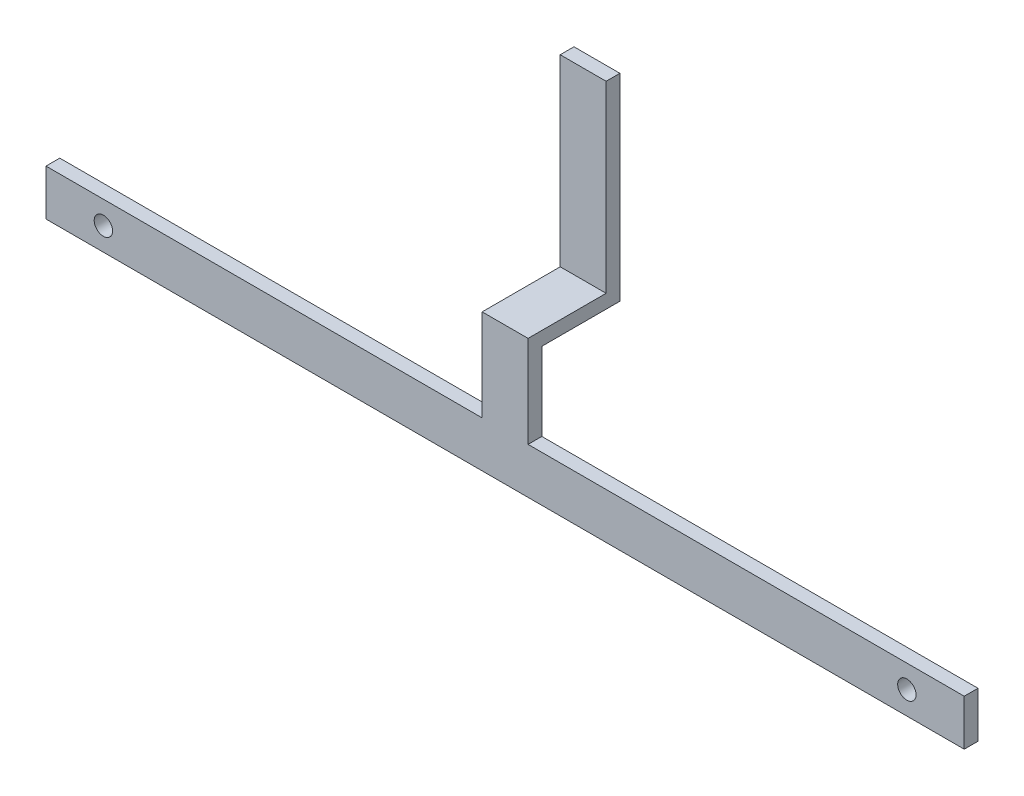
ISO-10303-21;
HEADER;
FILE_DESCRIPTION(('STEP AP214'),'2;1');
FILE_NAME('part.step','',(''),(''),'','','');
FILE_SCHEMA(('AUTOMOTIVE_DESIGN { 1 0 10303 214 1 1 1 1 }'));
ENDSEC;
DATA;
#1=APPLICATION_CONTEXT('core data for automotive mechanical design processes');
#2=APPLICATION_PROTOCOL_DEFINITION('international standard','automotive_design',2000,#1);
#3=PRODUCT_CONTEXT('',#1,'mechanical');
#4=PRODUCT('Part','Part','',(#3));
#5=PRODUCT_RELATED_PRODUCT_CATEGORY('part','',(#4));
#6=PRODUCT_DEFINITION_FORMATION('','',#4);
#7=PRODUCT_DEFINITION_CONTEXT('part definition',#1,'design');
#8=PRODUCT_DEFINITION('design','',#6,#7);
#9=PRODUCT_DEFINITION_SHAPE('','',#8);
#10=(LENGTH_UNIT() NAMED_UNIT(*) SI_UNIT(.MILLI.,.METRE.));
#11=(NAMED_UNIT(*) PLANE_ANGLE_UNIT() SI_UNIT($,.RADIAN.));
#12=(NAMED_UNIT(*) SI_UNIT($,.STERADIAN.) SOLID_ANGLE_UNIT());
#13=UNCERTAINTY_MEASURE_WITH_UNIT(LENGTH_MEASURE(1.E-05),#10,'distance_accuracy_value','');
#14=(GEOMETRIC_REPRESENTATION_CONTEXT(3) GLOBAL_UNCERTAINTY_ASSIGNED_CONTEXT((#13)) GLOBAL_UNIT_ASSIGNED_CONTEXT((#10,
#11,#12)) REPRESENTATION_CONTEXT('',''));
#15=CARTESIAN_POINT('',(0.,0.,0.));
#16=DIRECTION('',(0.,0.,1.));
#17=DIRECTION('',(1.,0.,0.));
#18=AXIS2_PLACEMENT_3D('',#15,#16,#17);
#19=CARTESIAN_POINT('',(0.,0.,0.));
#20=DIRECTION('',(0.,0.,1.));
#21=DIRECTION('',(1.,0.,0.));
#22=AXIS2_PLACEMENT_3D('',#19,#20,#21);
#23=PLANE('',#22);
#24=CARTESIAN_POINT('',(187.5,-5.,0.));
#25=DIRECTION('',(0.,0.,1.));
#26=DIRECTION('',(1.,0.,0.));
#27=AXIS2_PLACEMENT_3D('',#24,#25,#26);
#28=CIRCLE('',#27,2.);
#29=CARTESIAN_POINT('',(189.5,-5.,0.));
#30=VERTEX_POINT('',#29);
#31=EDGE_CURVE('E183',#30,#30,#28,.T.);
#32=ORIENTED_EDGE('',*,*,#31,.T.);
#33=EDGE_LOOP('',(#32));
#34=FACE_BOUND('',#33,.T.);
#35=CARTESIAN_POINT('',(12.5,-5.,0.));
#36=DIRECTION('',(0.,0.,1.));
#37=DIRECTION('',(1.,0.,0.));
#38=AXIS2_PLACEMENT_3D('',#35,#36,#37);
#39=CIRCLE('',#38,2.);
#40=CARTESIAN_POINT('',(14.5,-5.,0.));
#41=VERTEX_POINT('',#40);
#42=EDGE_CURVE('E193',#41,#41,#39,.T.);
#43=ORIENTED_EDGE('',*,*,#42,.T.);
#44=EDGE_LOOP('',(#43));
#45=FACE_BOUND('',#44,.T.);
#46=DIRECTION('',(-1.,0.,0.));
#47=VECTOR('',#46,1.);
#48=CARTESIAN_POINT('',(105.,17.,0.));
#49=LINE('',#48,#47);
#50=CARTESIAN_POINT('',(105.,17.,0.));
#51=VERTEX_POINT('',#50);
#52=CARTESIAN_POINT('',(95.,17.,0.));
#53=VERTEX_POINT('',#52);
#54=EDGE_CURVE('E59',#51,#53,#49,.T.);
#55=ORIENTED_EDGE('',*,*,#54,.F.);
#56=DIRECTION('',(0.,1.,0.));
#57=VECTOR('',#56,1.);
#58=CARTESIAN_POINT('',(105.,20.,0.));
#59=LINE('',#58,#57);
#60=CARTESIAN_POINT('',(105.,0.,0.));
#61=VERTEX_POINT('',#60);
#62=EDGE_CURVE('E171',#61,#51,#59,.T.);
#63=ORIENTED_EDGE('',*,*,#62,.F.);
#64=DIRECTION('',(-1.,0.,0.));
#65=VECTOR('',#64,1.);
#66=CARTESIAN_POINT('',(0.,0.,0.));
#67=LINE('',#66,#65);
#68=CARTESIAN_POINT('',(200.,0.,0.));
#69=VERTEX_POINT('',#68);
#70=EDGE_CURVE('E206',#69,#61,#67,.T.);
#71=ORIENTED_EDGE('',*,*,#70,.F.);
#72=DIRECTION('',(0.,1.,0.));
#73=VECTOR('',#72,1.);
#74=CARTESIAN_POINT('',(200.,0.,0.));
#75=LINE('',#74,#73);
#76=CARTESIAN_POINT('',(200.,-10.,0.));
#77=VERTEX_POINT('',#76);
#78=EDGE_CURVE('E219',#77,#69,#75,.T.);
#79=ORIENTED_EDGE('',*,*,#78,.F.);
#80=DIRECTION('',(1.,0.,0.));
#81=VECTOR('',#80,1.);
#82=CARTESIAN_POINT('',(0.,-10.,0.));
#83=LINE('',#82,#81);
#84=CARTESIAN_POINT('',(0.,-10.,0.));
#85=VERTEX_POINT('',#84);
#86=EDGE_CURVE('E217',#85,#77,#83,.T.);
#87=ORIENTED_EDGE('',*,*,#86,.F.);
#88=DIRECTION('',(0.,-1.,0.));
#89=VECTOR('',#88,1.);
#90=CARTESIAN_POINT('',(0.,0.,0.));
#91=LINE('',#90,#89);
#92=CARTESIAN_POINT('',(0.,0.,0.));
#93=VERTEX_POINT('',#92);
#94=EDGE_CURVE('E199',#93,#85,#91,.T.);
#95=ORIENTED_EDGE('',*,*,#94,.F.);
#96=CARTESIAN_POINT('',(95.,0.,0.));
#97=VERTEX_POINT('',#96);
#98=EDGE_CURVE('E221',#97,#93,#67,.T.);
#99=ORIENTED_EDGE('',*,*,#98,.F.);
#100=DIRECTION('',(0.,-1.,0.));
#101=VECTOR('',#100,1.);
#102=CARTESIAN_POINT('',(95.,20.,0.));
#103=LINE('',#102,#101);
#104=EDGE_CURVE('E169',#53,#97,#103,.T.);
#105=ORIENTED_EDGE('',*,*,#104,.F.);
#106=EDGE_LOOP('',(#55,#63,#71,#79,#87,#95,#99,#105));
#107=FACE_BOUND('',#106,.T.);
#108=ADVANCED_FACE('F36',(#34,#45,#107),#23,.F.);
#109=CARTESIAN_POINT('',(0.,0.,3.));
#110=DIRECTION('',(0.,-1.,0.));
#111=DIRECTION('',(0.,0.,-1.));
#112=AXIS2_PLACEMENT_3D('',#109,#110,#111);
#113=PLANE('',#112);
#114=DIRECTION('',(0.,0.,1.));
#115=VECTOR('',#114,1.);
#116=CARTESIAN_POINT('',(95.,0.,0.));
#117=LINE('',#116,#115);
#118=CARTESIAN_POINT('',(95.,0.,3.));
#119=VERTEX_POINT('',#118);
#120=EDGE_CURVE('E174',#97,#119,#117,.T.);
#121=ORIENTED_EDGE('',*,*,#120,.F.);
#122=ORIENTED_EDGE('',*,*,#98,.T.);
#123=DIRECTION('',(0.,0.,-1.));
#124=VECTOR('',#123,1.);
#125=CARTESIAN_POINT('',(0.,0.,3.));
#126=LINE('',#125,#124);
#127=CARTESIAN_POINT('',(0.,0.,3.));
#128=VERTEX_POINT('',#127);
#129=EDGE_CURVE('E214',#128,#93,#126,.T.);
#130=ORIENTED_EDGE('',*,*,#129,.F.);
#131=DIRECTION('',(-1.,0.,0.));
#132=VECTOR('',#131,1.);
#133=CARTESIAN_POINT('',(0.,0.,3.));
#134=LINE('',#133,#132);
#135=EDGE_CURVE('E210',#119,#128,#134,.T.);
#136=ORIENTED_EDGE('',*,*,#135,.F.);
#137=EDGE_LOOP('',(#121,#122,#130,#136));
#138=FACE_BOUND('',#137,.T.);
#139=ADVANCED_FACE('F253',(#138),#113,.F.);
#140=CARTESIAN_POINT('',(0.,0.,3.));
#141=DIRECTION('',(0.,0.,1.));
#142=DIRECTION('',(1.,0.,0.));
#143=AXIS2_PLACEMENT_3D('',#140,#141,#142);
#144=PLANE('',#143);
#145=CARTESIAN_POINT('',(12.5,-5.,3.));
#146=DIRECTION('',(0.,0.,1.));
#147=DIRECTION('',(1.,0.,0.));
#148=AXIS2_PLACEMENT_3D('',#145,#146,#147);
#149=CIRCLE('',#148,2.);
#150=CARTESIAN_POINT('',(14.5,-5.,3.));
#151=VERTEX_POINT('',#150);
#152=EDGE_CURVE('E196',#151,#151,#149,.T.);
#153=ORIENTED_EDGE('',*,*,#152,.F.);
#154=EDGE_LOOP('',(#153));
#155=FACE_BOUND('',#154,.T.);
#156=DIRECTION('',(0.,-1.,0.));
#157=VECTOR('',#156,1.);
#158=CARTESIAN_POINT('',(0.,0.,3.));
#159=LINE('',#158,#157);
#160=CARTESIAN_POINT('',(0.,-10.,3.));
#161=VERTEX_POINT('',#160);
#162=EDGE_CURVE('E202',#128,#161,#159,.T.);
#163=ORIENTED_EDGE('',*,*,#162,.T.);
#164=DIRECTION('',(1.,0.,0.));
#165=VECTOR('',#164,1.);
#166=CARTESIAN_POINT('',(0.,-10.,3.));
#167=LINE('',#166,#165);
#168=CARTESIAN_POINT('',(200.,-10.,3.));
#169=VERTEX_POINT('',#168);
#170=EDGE_CURVE('E205',#161,#169,#167,.T.);
#171=ORIENTED_EDGE('',*,*,#170,.T.);
#172=DIRECTION('',(0.,1.,0.));
#173=VECTOR('',#172,1.);
#174=CARTESIAN_POINT('',(200.,0.,3.));
#175=LINE('',#174,#173);
#176=CARTESIAN_POINT('',(200.,0.,3.));
#177=VERTEX_POINT('',#176);
#178=EDGE_CURVE('E208',#169,#177,#175,.T.);
#179=ORIENTED_EDGE('',*,*,#178,.T.);
#180=CARTESIAN_POINT('',(105.,0.,3.));
#181=VERTEX_POINT('',#180);
#182=EDGE_CURVE('E211',#177,#181,#134,.T.);
#183=ORIENTED_EDGE('',*,*,#182,.T.);
#184=DIRECTION('',(0.,1.,0.));
#185=VECTOR('',#184,1.);
#186=CARTESIAN_POINT('',(105.,20.,3.));
#187=LINE('',#186,#185);
#188=CARTESIAN_POINT('',(105.,20.,3.));
#189=VERTEX_POINT('',#188);
#190=EDGE_CURVE('E177',#181,#189,#187,.T.);
#191=ORIENTED_EDGE('',*,*,#190,.T.);
#192=DIRECTION('',(-1.,0.,0.));
#193=VECTOR('',#192,1.);
#194=CARTESIAN_POINT('',(95.,20.,3.));
#195=LINE('',#194,#193);
#196=CARTESIAN_POINT('',(95.,20.,3.));
#197=VERTEX_POINT('',#196);
#198=EDGE_CURVE('E172',#189,#197,#195,.T.);
#199=ORIENTED_EDGE('',*,*,#198,.T.);
#200=DIRECTION('',(0.,-1.,0.));
#201=VECTOR('',#200,1.);
#202=CARTESIAN_POINT('',(95.,20.,3.));
#203=LINE('',#202,#201);
#204=EDGE_CURVE('E168',#197,#119,#203,.T.);
#205=ORIENTED_EDGE('',*,*,#204,.T.);
#206=ORIENTED_EDGE('',*,*,#135,.T.);
#207=EDGE_LOOP('',(#163,#171,#179,#183,#191,#199,#205,#206));
#208=FACE_BOUND('',#207,.T.);
#209=CARTESIAN_POINT('',(187.5,-5.,3.));
#210=DIRECTION('',(0.,0.,1.));
#211=DIRECTION('',(1.,0.,0.));
#212=AXIS2_PLACEMENT_3D('',#209,#210,#211);
#213=CIRCLE('',#212,2.);
#214=CARTESIAN_POINT('',(189.5,-5.,3.));
#215=VERTEX_POINT('',#214);
#216=EDGE_CURVE('E190',#215,#215,#213,.T.);
#217=ORIENTED_EDGE('',*,*,#216,.F.);
#218=EDGE_LOOP('',(#217));
#219=FACE_BOUND('',#218,.T.);
#220=ADVANCED_FACE('F242',(#155,#208,#219),#144,.T.);
#221=CARTESIAN_POINT('',(0.,0.,3.));
#222=DIRECTION('',(1.,0.,0.));
#223=DIRECTION('',(0.,1.,0.));
#224=AXIS2_PLACEMENT_3D('',#221,#222,#223);
#225=PLANE('',#224);
#226=ORIENTED_EDGE('',*,*,#94,.T.);
#227=DIRECTION('',(0.,0.,-1.));
#228=VECTOR('',#227,1.);
#229=CARTESIAN_POINT('',(0.,-10.,3.));
#230=LINE('',#229,#228);
#231=EDGE_CURVE('E11',#161,#85,#230,.T.);
#232=ORIENTED_EDGE('',*,*,#231,.F.);
#233=ORIENTED_EDGE('',*,*,#162,.F.);
#234=ORIENTED_EDGE('',*,*,#129,.T.);
#235=EDGE_LOOP('',(#226,#232,#233,#234));
#236=FACE_BOUND('',#235,.T.);
#237=ADVANCED_FACE('F38',(#236),#225,.F.);
#238=CARTESIAN_POINT('',(0.,-10.,3.));
#239=DIRECTION('',(0.,1.,0.));
#240=DIRECTION('',(0.,0.,1.));
#241=AXIS2_PLACEMENT_3D('',#238,#239,#240);
#242=PLANE('',#241);
#243=ORIENTED_EDGE('',*,*,#86,.T.);
#244=DIRECTION('',(0.,0.,-1.));
#245=VECTOR('',#244,1.);
#246=CARTESIAN_POINT('',(200.,-10.,3.));
#247=LINE('',#246,#245);
#248=EDGE_CURVE('E44',#169,#77,#247,.T.);
#249=ORIENTED_EDGE('',*,*,#248,.F.);
#250=ORIENTED_EDGE('',*,*,#170,.F.);
#251=ORIENTED_EDGE('',*,*,#231,.T.);
#252=EDGE_LOOP('',(#243,#249,#250,#251));
#253=FACE_BOUND('',#252,.T.);
#254=ADVANCED_FACE('F247',(#253),#242,.F.);
#255=CARTESIAN_POINT('',(200.,0.,3.));
#256=DIRECTION('',(-1.,0.,0.));
#257=DIRECTION('',(0.,0.,1.));
#258=AXIS2_PLACEMENT_3D('',#255,#256,#257);
#259=PLANE('',#258);
#260=ORIENTED_EDGE('',*,*,#78,.T.);
#261=DIRECTION('',(0.,0.,-1.));
#262=VECTOR('',#261,1.);
#263=CARTESIAN_POINT('',(200.,0.,3.));
#264=LINE('',#263,#262);
#265=EDGE_CURVE('E226',#177,#69,#264,.T.);
#266=ORIENTED_EDGE('',*,*,#265,.F.);
#267=ORIENTED_EDGE('',*,*,#178,.F.);
#268=ORIENTED_EDGE('',*,*,#248,.T.);
#269=EDGE_LOOP('',(#260,#266,#267,#268));
#270=FACE_BOUND('',#269,.T.);
#271=ADVANCED_FACE('F233',(#270),#259,.F.);
#272=ORIENTED_EDGE('',*,*,#70,.T.);
#273=DIRECTION('',(0.,0.,1.));
#274=VECTOR('',#273,1.);
#275=CARTESIAN_POINT('',(105.,0.,0.));
#276=LINE('',#275,#274);
#277=EDGE_CURVE('E186',#61,#181,#276,.T.);
#278=ORIENTED_EDGE('',*,*,#277,.T.);
#279=ORIENTED_EDGE('',*,*,#182,.F.);
#280=ORIENTED_EDGE('',*,*,#265,.T.);
#281=EDGE_LOOP('',(#272,#278,#279,#280));
#282=FACE_BOUND('',#281,.T.);
#283=ADVANCED_FACE('F239',(#282),#113,.F.);
#284=CARTESIAN_POINT('',(12.5,-5.,3.));
#285=DIRECTION('',(0.,0.,-1.));
#286=DIRECTION('',(-1.,0.,0.));
#287=AXIS2_PLACEMENT_3D('',#284,#285,#286);
#288=CYLINDRICAL_SURFACE('',#287,2.);
#289=ORIENTED_EDGE('',*,*,#152,.T.);
#290=EDGE_LOOP('',(#289));
#291=FACE_BOUND('',#290,.T.);
#292=ORIENTED_EDGE('',*,*,#42,.F.);
#293=EDGE_LOOP('',(#292));
#294=FACE_BOUND('',#293,.T.);
#295=ADVANCED_FACE('F287',(#291,#294),#288,.F.);
#296=CARTESIAN_POINT('',(187.5,-5.,3.));
#297=DIRECTION('',(0.,0.,-1.));
#298=DIRECTION('',(-1.,0.,0.));
#299=AXIS2_PLACEMENT_3D('',#296,#297,#298);
#300=CYLINDRICAL_SURFACE('',#299,2.);
#301=ORIENTED_EDGE('',*,*,#216,.T.);
#302=EDGE_LOOP('',(#301));
#303=FACE_BOUND('',#302,.T.);
#304=ORIENTED_EDGE('',*,*,#31,.F.);
#305=EDGE_LOOP('',(#304));
#306=FACE_BOUND('',#305,.T.);
#307=ADVANCED_FACE('F303',(#303,#306),#300,.F.);
#308=CARTESIAN_POINT('',(95.,20.,0.));
#309=DIRECTION('',(-1.,0.,0.));
#310=DIRECTION('',(0.,0.,1.));
#311=AXIS2_PLACEMENT_3D('',#308,#309,#310);
#312=PLANE('',#311);
#313=ORIENTED_EDGE('',*,*,#204,.F.);
#314=DIRECTION('',(0.,0.,1.));
#315=VECTOR('',#314,1.);
#316=CARTESIAN_POINT('',(95.,20.,0.));
#317=LINE('',#316,#315);
#318=CARTESIAN_POINT('',(95.,20.,-14.));
#319=VERTEX_POINT('',#318);
#320=EDGE_CURVE('E149',#319,#197,#317,.T.);
#321=ORIENTED_EDGE('',*,*,#320,.F.);
#322=DIRECTION('',(0.,-1.,0.));
#323=VECTOR('',#322,1.);
#324=CARTESIAN_POINT('',(95.,60.,-14.));
#325=LINE('',#324,#323);
#326=CARTESIAN_POINT('',(95.,60.,-14.));
#327=VERTEX_POINT('',#326);
#328=EDGE_CURVE('E130',#327,#319,#325,.T.);
#329=ORIENTED_EDGE('',*,*,#328,.F.);
#330=DIRECTION('',(0.,0.,1.));
#331=VECTOR('',#330,1.);
#332=CARTESIAN_POINT('',(95.,60.,-17.));
#333=LINE('',#332,#331);
#334=CARTESIAN_POINT('',(95.,60.,-17.));
#335=VERTEX_POINT('',#334);
#336=EDGE_CURVE('E137',#335,#327,#333,.T.);
#337=ORIENTED_EDGE('',*,*,#336,.F.);
#338=DIRECTION('',(0.,1.,0.));
#339=VECTOR('',#338,1.);
#340=CARTESIAN_POINT('',(95.,20.,-17.));
#341=LINE('',#340,#339);
#342=CARTESIAN_POINT('',(95.,17.,-17.));
#343=VERTEX_POINT('',#342);
#344=EDGE_CURVE('E160',#343,#335,#341,.T.);
#345=ORIENTED_EDGE('',*,*,#344,.F.);
#346=DIRECTION('',(0.,0.,1.));
#347=VECTOR('',#346,1.);
#348=CARTESIAN_POINT('',(95.,17.,-17.));
#349=LINE('',#348,#347);
#350=EDGE_CURVE('E161',#343,#53,#349,.T.);
#351=ORIENTED_EDGE('',*,*,#350,.T.);
#352=ORIENTED_EDGE('',*,*,#104,.T.);
#353=ORIENTED_EDGE('',*,*,#120,.T.);
#354=EDGE_LOOP('',(#313,#321,#329,#337,#345,#351,#352,#353));
#355=FACE_BOUND('',#354,.T.);
#356=ADVANCED_FACE('F148',(#355),#312,.T.);
#357=CARTESIAN_POINT('',(95.,20.,0.));
#358=DIRECTION('',(0.,1.,0.));
#359=DIRECTION('',(0.,0.,1.));
#360=AXIS2_PLACEMENT_3D('',#357,#358,#359);
#361=PLANE('',#360);
#362=DIRECTION('',(1.,0.,0.));
#363=VECTOR('',#362,1.);
#364=CARTESIAN_POINT('',(95.,20.,-14.));
#365=LINE('',#364,#363);
#366=CARTESIAN_POINT('',(105.,20.,-14.));
#367=VERTEX_POINT('',#366);
#368=EDGE_CURVE('E51',#319,#367,#365,.T.);
#369=ORIENTED_EDGE('',*,*,#368,.F.);
#370=ORIENTED_EDGE('',*,*,#320,.T.);
#371=ORIENTED_EDGE('',*,*,#198,.F.);
#372=DIRECTION('',(0.,0.,1.));
#373=VECTOR('',#372,1.);
#374=CARTESIAN_POINT('',(105.,20.,0.));
#375=LINE('',#374,#373);
#376=EDGE_CURVE('E184',#367,#189,#375,.T.);
#377=ORIENTED_EDGE('',*,*,#376,.F.);
#378=EDGE_LOOP('',(#369,#370,#371,#377));
#379=FACE_BOUND('',#378,.T.);
#380=ADVANCED_FACE('F255',(#379),#361,.T.);
#381=CARTESIAN_POINT('',(105.,20.,0.));
#382=DIRECTION('',(1.,0.,0.));
#383=DIRECTION('',(0.,0.,-1.));
#384=AXIS2_PLACEMENT_3D('',#381,#382,#383);
#385=PLANE('',#384);
#386=ORIENTED_EDGE('',*,*,#190,.F.);
#387=ORIENTED_EDGE('',*,*,#277,.F.);
#388=ORIENTED_EDGE('',*,*,#62,.T.);
#389=DIRECTION('',(0.,0.,1.));
#390=VECTOR('',#389,1.);
#391=CARTESIAN_POINT('',(105.,17.,-17.));
#392=LINE('',#391,#390);
#393=CARTESIAN_POINT('',(105.,17.,-17.));
#394=VERTEX_POINT('',#393);
#395=EDGE_CURVE('E165',#394,#51,#392,.T.);
#396=ORIENTED_EDGE('',*,*,#395,.F.);
#397=DIRECTION('',(0.,-1.,0.));
#398=VECTOR('',#397,1.);
#399=CARTESIAN_POINT('',(105.,20.,-17.));
#400=LINE('',#399,#398);
#401=CARTESIAN_POINT('',(105.,60.,-17.));
#402=VERTEX_POINT('',#401);
#403=EDGE_CURVE('E151',#402,#394,#400,.T.);
#404=ORIENTED_EDGE('',*,*,#403,.F.);
#405=DIRECTION('',(0.,0.,-1.));
#406=VECTOR('',#405,1.);
#407=CARTESIAN_POINT('',(105.,60.,-17.));
#408=LINE('',#407,#406);
#409=CARTESIAN_POINT('',(105.,60.,-14.));
#410=VERTEX_POINT('',#409);
#411=EDGE_CURVE('E136',#410,#402,#408,.T.);
#412=ORIENTED_EDGE('',*,*,#411,.F.);
#413=DIRECTION('',(0.,-1.,0.));
#414=VECTOR('',#413,1.);
#415=CARTESIAN_POINT('',(105.,60.,-14.));
#416=LINE('',#415,#414);
#417=EDGE_CURVE('E132',#410,#367,#416,.T.);
#418=ORIENTED_EDGE('',*,*,#417,.T.);
#419=ORIENTED_EDGE('',*,*,#376,.T.);
#420=EDGE_LOOP('',(#386,#387,#388,#396,#404,#412,#418,#419));
#421=FACE_BOUND('',#420,.T.);
#422=ADVANCED_FACE('F257',(#421),#385,.T.);
#423=CARTESIAN_POINT('',(105.,17.,-17.));
#424=DIRECTION('',(0.,1.,0.));
#425=DIRECTION('',(0.,0.,1.));
#426=AXIS2_PLACEMENT_3D('',#423,#424,#425);
#427=PLANE('',#426);
#428=ORIENTED_EDGE('',*,*,#54,.T.);
#429=ORIENTED_EDGE('',*,*,#350,.F.);
#430=DIRECTION('',(-1.,0.,0.));
#431=VECTOR('',#430,1.);
#432=CARTESIAN_POINT('',(105.,17.,-17.));
#433=LINE('',#432,#431);
#434=EDGE_CURVE('E158',#394,#343,#433,.T.);
#435=ORIENTED_EDGE('',*,*,#434,.F.);
#436=ORIENTED_EDGE('',*,*,#395,.T.);
#437=EDGE_LOOP('',(#428,#429,#435,#436));
#438=FACE_BOUND('',#437,.T.);
#439=ADVANCED_FACE('F265',(#438),#427,.F.);
#440=CARTESIAN_POINT('',(0.,0.,-17.));
#441=DIRECTION('',(0.,0.,-1.));
#442=DIRECTION('',(-1.,0.,0.));
#443=AXIS2_PLACEMENT_3D('',#440,#441,#442);
#444=PLANE('',#443);
#445=ORIENTED_EDGE('',*,*,#403,.T.);
#446=ORIENTED_EDGE('',*,*,#434,.T.);
#447=ORIENTED_EDGE('',*,*,#344,.T.);
#448=DIRECTION('',(-1.,0.,0.));
#449=VECTOR('',#448,1.);
#450=CARTESIAN_POINT('',(95.,60.,-17.));
#451=LINE('',#450,#449);
#452=EDGE_CURVE('E143',#402,#335,#451,.T.);
#453=ORIENTED_EDGE('',*,*,#452,.F.);
#454=EDGE_LOOP('',(#445,#446,#447,#453));
#455=FACE_BOUND('',#454,.T.);
#456=ADVANCED_FACE('F262',(#455),#444,.T.);
#457=CARTESIAN_POINT('',(95.,60.,-14.));
#458=DIRECTION('',(0.,0.,-1.));
#459=DIRECTION('',(-1.,0.,0.));
#460=AXIS2_PLACEMENT_3D('',#457,#458,#459);
#461=PLANE('',#460);
#462=ORIENTED_EDGE('',*,*,#368,.T.);
#463=ORIENTED_EDGE('',*,*,#417,.F.);
#464=DIRECTION('',(1.,0.,0.));
#465=VECTOR('',#464,1.);
#466=CARTESIAN_POINT('',(95.,60.,-14.));
#467=LINE('',#466,#465);
#468=EDGE_CURVE('E126',#327,#410,#467,.T.);
#469=ORIENTED_EDGE('',*,*,#468,.F.);
#470=ORIENTED_EDGE('',*,*,#328,.T.);
#471=EDGE_LOOP('',(#462,#463,#469,#470));
#472=FACE_BOUND('',#471,.T.);
#473=ADVANCED_FACE('F128',(#472),#461,.F.);
#474=CARTESIAN_POINT('',(0.,60.,0.));
#475=DIRECTION('',(0.,1.,0.));
#476=DIRECTION('',(0.,0.,1.));
#477=AXIS2_PLACEMENT_3D('',#474,#475,#476);
#478=PLANE('',#477);
#479=ORIENTED_EDGE('',*,*,#336,.T.);
#480=ORIENTED_EDGE('',*,*,#468,.T.);
#481=ORIENTED_EDGE('',*,*,#411,.T.);
#482=ORIENTED_EDGE('',*,*,#452,.T.);
#483=EDGE_LOOP('',(#479,#480,#481,#482));
#484=FACE_BOUND('',#483,.T.);
#485=ADVANCED_FACE('F141',(#484),#478,.T.);
#486=CLOSED_SHELL('',(#108,#139,#220,#237,#254,#271,#283,#295,#307,#356,#380,#422,#439,#456,
#473,#485));
#487=MANIFOLD_SOLID_BREP('B2',#486);
#488=ADVANCED_BREP_SHAPE_REPRESENTATION('',(#18,#487),#14);
#489=SHAPE_DEFINITION_REPRESENTATION(#9,#488);
ENDSEC;
END-ISO-10303-21;
